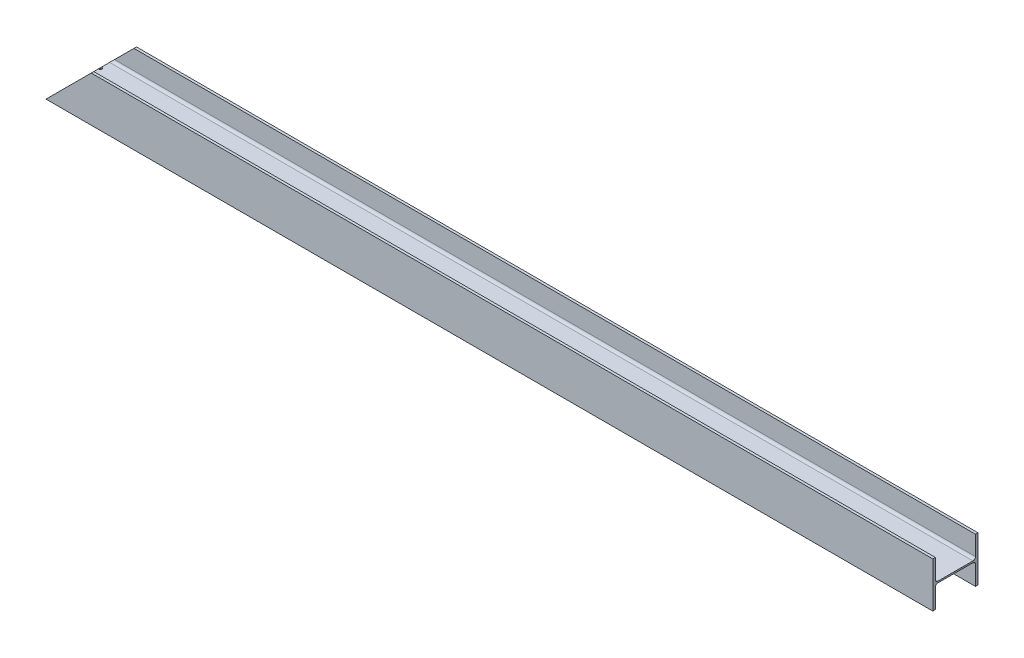
ISO-10303-21;
HEADER;
FILE_DESCRIPTION(('STEP AP214'),'2;1');
FILE_NAME('part.step','',(''),(''),'','','');
FILE_SCHEMA(('AUTOMOTIVE_DESIGN { 1 0 10303 214 1 1 1 1 }'));
ENDSEC;
DATA;
#1=APPLICATION_CONTEXT('core data for automotive mechanical design processes');
#2=APPLICATION_PROTOCOL_DEFINITION('international standard','automotive_design',2000,#1);
#3=PRODUCT_CONTEXT('',#1,'mechanical');
#4=PRODUCT('Part','Part','',(#3));
#5=PRODUCT_RELATED_PRODUCT_CATEGORY('part','',(#4));
#6=PRODUCT_DEFINITION_FORMATION('','',#4);
#7=PRODUCT_DEFINITION_CONTEXT('part definition',#1,'design');
#8=PRODUCT_DEFINITION('design','',#6,#7);
#9=PRODUCT_DEFINITION_SHAPE('','',#8);
#10=(LENGTH_UNIT() NAMED_UNIT(*) SI_UNIT(.MILLI.,.METRE.));
#11=(NAMED_UNIT(*) PLANE_ANGLE_UNIT() SI_UNIT($,.RADIAN.));
#12=(NAMED_UNIT(*) SI_UNIT($,.STERADIAN.) SOLID_ANGLE_UNIT());
#13=UNCERTAINTY_MEASURE_WITH_UNIT(LENGTH_MEASURE(1.E-05),#10,'distance_accuracy_value','');
#14=(GEOMETRIC_REPRESENTATION_CONTEXT(3) GLOBAL_UNCERTAINTY_ASSIGNED_CONTEXT((#13)) GLOBAL_UNIT_ASSIGNED_CONTEXT((#10,
#11,#12)) REPRESENTATION_CONTEXT('',''));
#15=CARTESIAN_POINT('',(0.,0.,0.));
#16=DIRECTION('',(0.,0.,1.));
#17=DIRECTION('',(1.,0.,0.));
#18=AXIS2_PLACEMENT_3D('',#15,#16,#17);
#19=CARTESIAN_POINT('',(-5000.,-127.,127.));
#20=DIRECTION('',(0.,-1.,0.));
#21=DIRECTION('',(0.,0.,-1.));
#22=AXIS2_PLACEMENT_3D('',#19,#20,#21);
#23=PLANE('',#22);
#24=DIRECTION('',(0.,0.,-1.));
#25=VECTOR('',#24,1.);
#26=CARTESIAN_POINT('',(-9.99999999999979,-127.,127.));
#27=LINE('',#26,#25);
#28=CARTESIAN_POINT('',(-9.99999999999979,-127.,127.));
#29=VERTEX_POINT('',#28);
#30=CARTESIAN_POINT('',(-9.99999999999979,-127.,112.8));
#31=VERTEX_POINT('',#30);
#32=EDGE_CURVE('E101',#29,#31,#27,.T.);
#33=ORIENTED_EDGE('',*,*,#32,.F.);
#34=DIRECTION('',(1.,0.,0.));
#35=VECTOR('',#34,1.);
#36=CARTESIAN_POINT('',(-5000.,-127.,127.));
#37=LINE('',#36,#35);
#38=CARTESIAN_POINT('',(-4990.,-126.999999999997,127.));
#39=VERTEX_POINT('',#38);
#40=EDGE_CURVE('E95',#39,#29,#37,.T.);
#41=ORIENTED_EDGE('',*,*,#40,.F.);
#42=DIRECTION('',(0.,0.,1.));
#43=VECTOR('',#42,1.);
#44=CARTESIAN_POINT('',(-4990.,-126.999999999998,-126.999999999996));
#45=LINE('',#44,#43);
#46=CARTESIAN_POINT('',(-4990.,-126.999999999997,112.8));
#47=VERTEX_POINT('',#46);
#48=EDGE_CURVE('E282',#47,#39,#45,.T.);
#49=ORIENTED_EDGE('',*,*,#48,.F.);
#50=DIRECTION('',(1.,0.,0.));
#51=VECTOR('',#50,1.);
#52=CARTESIAN_POINT('',(-5000.,-127.,112.8));
#53=LINE('',#52,#51);
#54=EDGE_CURVE('E284',#47,#31,#53,.T.);
#55=ORIENTED_EDGE('',*,*,#54,.T.);
#56=EDGE_LOOP('',(#33,#41,#49,#55));
#57=FACE_BOUND('',#56,.T.);
#58=ADVANCED_FACE('F88',(#57),#23,.T.);
#59=CARTESIAN_POINT('',(-5000.,-127.,127.));
#60=DIRECTION('',(0.,0.,-1.));
#61=DIRECTION('',(0.,1.,0.));
#62=AXIS2_PLACEMENT_3D('',#59,#60,#61);
#63=PLANE('',#62);
#64=DIRECTION('',(1.,0.,0.));
#65=VECTOR('',#64,1.);
#66=CARTESIAN_POINT('',(-5000.,127.,127.));
#67=LINE('',#66,#65);
#68=CARTESIAN_POINT('',(-4736.,127.000000000003,127.));
#69=VERTEX_POINT('',#68);
#70=CARTESIAN_POINT('',(-9.99999999999979,127.,127.));
#71=VERTEX_POINT('',#70);
#72=EDGE_CURVE('E271',#69,#71,#67,.T.);
#73=ORIENTED_EDGE('',*,*,#72,.F.);
#74=DIRECTION('',(0.707106781186547,0.707106781186548,0.));
#75=VECTOR('',#74,1.);
#76=CARTESIAN_POINT('',(-4990.,-126.999999999997,127.));
#77=LINE('',#76,#75);
#78=EDGE_CURVE('E246',#39,#69,#77,.T.);
#79=ORIENTED_EDGE('',*,*,#78,.F.);
#80=ORIENTED_EDGE('',*,*,#40,.T.);
#81=DIRECTION('',(0.,1.,0.));
#82=VECTOR('',#81,1.);
#83=CARTESIAN_POINT('',(-9.99999999999979,-127.,127.));
#84=LINE('',#83,#82);
#85=EDGE_CURVE('E279',#29,#71,#84,.T.);
#86=ORIENTED_EDGE('',*,*,#85,.T.);
#87=EDGE_LOOP('',(#73,#79,#80,#86));
#88=FACE_BOUND('',#87,.T.);
#89=ADVANCED_FACE('F278',(#88),#63,.F.);
#90=CARTESIAN_POINT('',(-5000.,127.,127.));
#91=DIRECTION('',(0.,-1.,0.));
#92=DIRECTION('',(0.,0.,-1.));
#93=AXIS2_PLACEMENT_3D('',#90,#91,#92);
#94=PLANE('',#93);
#95=DIRECTION('',(1.,0.,0.));
#96=VECTOR('',#95,1.);
#97=CARTESIAN_POINT('',(-5000.,127.000000000001,112.8));
#98=LINE('',#97,#96);
#99=CARTESIAN_POINT('',(-4736.,127.000000000003,112.8));
#100=VERTEX_POINT('',#99);
#101=CARTESIAN_POINT('',(-9.99999999999979,127.000000000001,112.8));
#102=VERTEX_POINT('',#101);
#103=EDGE_CURVE('E269',#100,#102,#98,.T.);
#104=ORIENTED_EDGE('',*,*,#103,.F.);
#105=DIRECTION('',(0.,0.,1.));
#106=VECTOR('',#105,1.);
#107=CARTESIAN_POINT('',(-4736.,127.000000000003,-127.));
#108=LINE('',#107,#106);
#109=EDGE_CURVE('E233',#100,#69,#108,.T.);
#110=ORIENTED_EDGE('',*,*,#109,.T.);
#111=ORIENTED_EDGE('',*,*,#72,.T.);
#112=DIRECTION('',(0.,0.,-1.));
#113=VECTOR('',#112,1.);
#114=CARTESIAN_POINT('',(-9.99999999999979,127.,127.));
#115=LINE('',#114,#113);
#116=EDGE_CURVE('E288',#71,#102,#115,.T.);
#117=ORIENTED_EDGE('',*,*,#116,.T.);
#118=EDGE_LOOP('',(#104,#110,#111,#117));
#119=FACE_BOUND('',#118,.T.);
#120=ADVANCED_FACE('F363',(#119),#94,.F.);
#121=CARTESIAN_POINT('',(-5000.,127.000000000001,112.8));
#122=DIRECTION('',(0.,0.,1.));
#123=DIRECTION('',(0.,-1.,0.));
#124=AXIS2_PLACEMENT_3D('',#121,#122,#123);
#125=PLANE('',#124);
#126=DIRECTION('',(1.,0.,0.));
#127=VECTOR('',#126,1.);
#128=CARTESIAN_POINT('',(-5000.,18.3000000000004,112.8));
#129=LINE('',#128,#127);
#130=CARTESIAN_POINT('',(-4844.7,18.3000000000004,112.8));
#131=VERTEX_POINT('',#130);
#132=CARTESIAN_POINT('',(-9.99999999999979,18.3000000000003,112.8));
#133=VERTEX_POINT('',#132);
#134=EDGE_CURVE('E267',#131,#133,#129,.T.);
#135=ORIENTED_EDGE('',*,*,#134,.F.);
#136=DIRECTION('',(0.707106781186547,0.707106781186548,0.));
#137=VECTOR('',#136,1.);
#138=CARTESIAN_POINT('',(-4868.,-4.99999999999787,112.8));
#139=LINE('',#138,#137);
#140=EDGE_CURVE('E373',#131,#100,#139,.T.);
#141=ORIENTED_EDGE('',*,*,#140,.T.);
#142=ORIENTED_EDGE('',*,*,#103,.T.);
#143=DIRECTION('',(0.,-1.,0.));
#144=VECTOR('',#143,1.);
#145=CARTESIAN_POINT('',(-9.99999999999979,127.000000000001,112.8));
#146=LINE('',#145,#144);
#147=EDGE_CURVE('E357',#102,#133,#146,.T.);
#148=ORIENTED_EDGE('',*,*,#147,.T.);
#149=EDGE_LOOP('',(#135,#141,#142,#148));
#150=FACE_BOUND('',#149,.T.);
#151=ADVANCED_FACE('F371',(#150),#125,.F.);
#152=CARTESIAN_POINT('',(-5000.,18.3000000000003,98.8));
#153=DIRECTION('',(1.,0.,0.));
#154=DIRECTION('',(0.,0.,-1.));
#155=AXIS2_PLACEMENT_3D('',#152,#153,#154);
#156=CYLINDRICAL_SURFACE('',#155,14.);
#157=DIRECTION('',(1.,0.,0.));
#158=VECTOR('',#157,1.);
#159=CARTESIAN_POINT('',(-5000.,4.30000000000035,98.8));
#160=LINE('',#159,#158);
#161=CARTESIAN_POINT('',(-4858.7,4.30000000000035,98.8));
#162=VERTEX_POINT('',#161);
#163=CARTESIAN_POINT('',(-9.99999999999979,4.30000000000035,98.8));
#164=VERTEX_POINT('',#163);
#165=EDGE_CURVE('E265',#162,#164,#160,.T.);
#166=ORIENTED_EDGE('',*,*,#165,.F.);
#167=CARTESIAN_POINT('',(-4844.7,18.3000000000003,98.8));
#168=DIRECTION('',(0.707106781186548,-0.707106781186547,0.));
#169=DIRECTION('',(0.707106781186547,0.707106781186548,0.));
#170=AXIS2_PLACEMENT_3D('',#167,#168,#169);
#171=ELLIPSE('',#170,19.7989898732233,14.);
#172=EDGE_CURVE('E376',#162,#131,#171,.F.);
#173=ORIENTED_EDGE('',*,*,#172,.T.);
#174=ORIENTED_EDGE('',*,*,#134,.T.);
#175=CARTESIAN_POINT('',(-9.99999999999979,18.3000000000003,98.8));
#176=DIRECTION('',(-1.,0.,0.));
#177=DIRECTION('',(0.,0.,1.));
#178=AXIS2_PLACEMENT_3D('',#175,#176,#177);
#179=CIRCLE('',#178,14.);
#180=EDGE_CURVE('E354',#133,#164,#179,.F.);
#181=ORIENTED_EDGE('',*,*,#180,.T.);
#182=EDGE_LOOP('',(#166,#173,#174,#181));
#183=FACE_BOUND('',#182,.T.);
#184=ADVANCED_FACE('F451',(#183),#156,.F.);
#185=CARTESIAN_POINT('',(-5000.,4.30000000000035,98.8));
#186=DIRECTION('',(0.,-1.,0.));
#187=DIRECTION('',(0.,0.,-1.));
#188=AXIS2_PLACEMENT_3D('',#185,#186,#187);
#189=PLANE('',#188);
#190=DIRECTION('',(1.,0.,0.));
#191=VECTOR('',#190,1.);
#192=CARTESIAN_POINT('',(-5000.,4.29999999999966,-98.8));
#193=LINE('',#192,#191);
#194=CARTESIAN_POINT('',(-4858.7,4.29999999999966,-98.8));
#195=VERTEX_POINT('',#194);
#196=CARTESIAN_POINT('',(-9.99999999999979,4.29999999999966,-98.8));
#197=VERTEX_POINT('',#196);
#198=EDGE_CURVE('E263',#195,#197,#193,.T.);
#199=ORIENTED_EDGE('',*,*,#198,.F.);
#200=DIRECTION('',(0.,0.,1.));
#201=VECTOR('',#200,1.);
#202=CARTESIAN_POINT('',(-4858.7,4.30000000000035,98.7999999999995));
#203=LINE('',#202,#201);
#204=CARTESIAN_POINT('',(-4858.70000000007,4.29999999993608,-53.8379861959636));
#205=VERTEX_POINT('',#204);
#206=EDGE_CURVE('E379',#195,#205,#203,.T.);
#207=ORIENTED_EDGE('',*,*,#206,.T.);
#208=CARTESIAN_POINT('',(-4857.,4.29999999993608,-45.0000000000148));
#209=DIRECTION('',(0.,1.,0.));
#210=DIRECTION('',(-1.,0.,0.));
#211=AXIS2_PLACEMENT_3D('',#208,#209,#210);
#212=CIRCLE('',#211,9.00000000000008);
#213=CARTESIAN_POINT('',(-4858.7,4.29999999993611,-36.1620138040537));
#214=VERTEX_POINT('',#213);
#215=EDGE_CURVE('E296',#214,#205,#212,.T.);
#216=ORIENTED_EDGE('',*,*,#215,.F.);
#217=CARTESIAN_POINT('',(-4858.70000000007,4.29999999993607,36.1620138040365));
#218=VERTEX_POINT('',#217);
#219=EDGE_CURVE('E381',#214,#218,#203,.T.);
#220=ORIENTED_EDGE('',*,*,#219,.T.);
#221=CARTESIAN_POINT('',(-4857.,4.29999999993607,44.9999999999852));
#222=DIRECTION('',(0.,1.,0.));
#223=DIRECTION('',(-1.,0.,0.));
#224=AXIS2_PLACEMENT_3D('',#221,#222,#223);
#225=CIRCLE('',#224,9.00000000000007);
#226=CARTESIAN_POINT('',(-4858.70000000007,4.29999999993607,53.837986195934));
#227=VERTEX_POINT('',#226);
#228=EDGE_CURVE('E292',#227,#218,#225,.T.);
#229=ORIENTED_EDGE('',*,*,#228,.F.);
#230=EDGE_CURVE('E661',#227,#162,#203,.T.);
#231=ORIENTED_EDGE('',*,*,#230,.T.);
#232=ORIENTED_EDGE('',*,*,#165,.T.);
#233=DIRECTION('',(0.,0.,-1.));
#234=VECTOR('',#233,1.);
#235=CARTESIAN_POINT('',(-9.99999999999979,4.30000000000035,98.8));
#236=LINE('',#235,#234);
#237=EDGE_CURVE('E351',#164,#197,#236,.T.);
#238=ORIENTED_EDGE('',*,*,#237,.T.);
#239=EDGE_LOOP('',(#199,#207,#216,#220,#229,#231,#232,#238));
#240=FACE_BOUND('',#239,.T.);
#241=ADVANCED_FACE('F454',(#240),#189,.F.);
#242=CARTESIAN_POINT('',(-5000.,18.2999999999997,-98.8000000000001));
#243=DIRECTION('',(1.,0.,0.));
#244=DIRECTION('',(0.,0.,-1.));
#245=AXIS2_PLACEMENT_3D('',#242,#243,#244);
#246=CYLINDRICAL_SURFACE('',#245,14.);
#247=CARTESIAN_POINT('',(-4844.7,18.2999999999997,-98.8000000000001));
#248=DIRECTION('',(0.707106781186548,-0.707106781186547,0.));
#249=DIRECTION('',(0.707106781186547,0.707106781186548,0.));
#250=AXIS2_PLACEMENT_3D('',#247,#248,#249);
#251=ELLIPSE('',#250,19.7989898732233,14.);
#252=CARTESIAN_POINT('',(-4844.7,18.2999999999996,-112.8));
#253=VERTEX_POINT('',#252);
#254=EDGE_CURVE('E385',#195,#253,#251,.T.);
#255=ORIENTED_EDGE('',*,*,#254,.F.);
#256=ORIENTED_EDGE('',*,*,#198,.T.);
#257=CARTESIAN_POINT('',(-9.99999999999979,18.2999999999997,-98.8000000000001));
#258=DIRECTION('',(-1.,0.,0.));
#259=DIRECTION('',(0.,0.,1.));
#260=AXIS2_PLACEMENT_3D('',#257,#258,#259);
#261=CIRCLE('',#260,14.);
#262=CARTESIAN_POINT('',(-9.99999999999979,18.2999999999996,-112.8));
#263=VERTEX_POINT('',#262);
#264=EDGE_CURVE('E348',#263,#197,#261,.T.);
#265=ORIENTED_EDGE('',*,*,#264,.F.);
#266=DIRECTION('',(1.,0.,0.));
#267=VECTOR('',#266,1.);
#268=CARTESIAN_POINT('',(-5000.,18.2999999999996,-112.8));
#269=LINE('',#268,#267);
#270=EDGE_CURVE('E255',#253,#263,#269,.T.);
#271=ORIENTED_EDGE('',*,*,#270,.F.);
#272=EDGE_LOOP('',(#255,#256,#265,#271));
#273=FACE_BOUND('',#272,.T.);
#274=ADVANCED_FACE('F458',(#273),#246,.F.);
#275=CARTESIAN_POINT('',(-5000.,127.,-112.8));
#276=DIRECTION('',(0.,0.,1.));
#277=DIRECTION('',(0.,-1.,0.));
#278=AXIS2_PLACEMENT_3D('',#275,#276,#277);
#279=PLANE('',#278);
#280=DIRECTION('',(0.707106781186547,0.707106781186548,0.));
#281=VECTOR('',#280,1.);
#282=CARTESIAN_POINT('',(-4868.,-4.99999999999828,-112.8));
#283=LINE('',#282,#281);
#284=CARTESIAN_POINT('',(-4736.,127.000000000003,-112.8));
#285=VERTEX_POINT('',#284);
#286=EDGE_CURVE('E228',#253,#285,#283,.T.);
#287=ORIENTED_EDGE('',*,*,#286,.F.);
#288=ORIENTED_EDGE('',*,*,#270,.T.);
#289=DIRECTION('',(0.,-1.,0.));
#290=VECTOR('',#289,1.);
#291=CARTESIAN_POINT('',(-9.99999999999979,127.,-112.8));
#292=LINE('',#291,#290);
#293=CARTESIAN_POINT('',(-9.99999999999979,127.,-112.8));
#294=VERTEX_POINT('',#293);
#295=EDGE_CURVE('E345',#294,#263,#292,.T.);
#296=ORIENTED_EDGE('',*,*,#295,.F.);
#297=DIRECTION('',(1.,0.,0.));
#298=VECTOR('',#297,1.);
#299=CARTESIAN_POINT('',(-5000.,127.,-112.8));
#300=LINE('',#299,#298);
#301=EDGE_CURVE('E252',#285,#294,#300,.T.);
#302=ORIENTED_EDGE('',*,*,#301,.F.);
#303=EDGE_LOOP('',(#287,#288,#296,#302));
#304=FACE_BOUND('',#303,.T.);
#305=ADVANCED_FACE('F462',(#304),#279,.T.);
#306=CARTESIAN_POINT('',(-5000.,127.,-127.));
#307=DIRECTION('',(0.,1.,0.));
#308=DIRECTION('',(0.,0.,1.));
#309=AXIS2_PLACEMENT_3D('',#306,#307,#308);
#310=PLANE('',#309);
#311=CARTESIAN_POINT('',(-4736.,127.000000000003,-127.));
#312=VERTEX_POINT('',#311);
#313=EDGE_CURVE('E222',#312,#285,#108,.T.);
#314=ORIENTED_EDGE('',*,*,#313,.T.);
#315=ORIENTED_EDGE('',*,*,#301,.T.);
#316=DIRECTION('',(0.,0.,1.));
#317=VECTOR('',#316,1.);
#318=CARTESIAN_POINT('',(-9.99999999999979,127.,-127.));
#319=LINE('',#318,#317);
#320=CARTESIAN_POINT('',(-9.99999999999979,127.,-127.));
#321=VERTEX_POINT('',#320);
#322=EDGE_CURVE('E251',#321,#294,#319,.T.);
#323=ORIENTED_EDGE('',*,*,#322,.F.);
#324=DIRECTION('',(1.,0.,0.));
#325=VECTOR('',#324,1.);
#326=CARTESIAN_POINT('',(-5000.,127.,-127.));
#327=LINE('',#326,#325);
#328=EDGE_CURVE('E240',#312,#321,#327,.T.);
#329=ORIENTED_EDGE('',*,*,#328,.F.);
#330=EDGE_LOOP('',(#314,#315,#323,#329));
#331=FACE_BOUND('',#330,.T.);
#332=ADVANCED_FACE('F249',(#331),#310,.T.);
#333=CARTESIAN_POINT('',(-5000.,-127.,-127.));
#334=DIRECTION('',(0.,0.,-1.));
#335=DIRECTION('',(0.,1.,0.));
#336=AXIS2_PLACEMENT_3D('',#333,#334,#335);
#337=PLANE('',#336);
#338=DIRECTION('',(0.707106781186547,0.707106781186548,0.));
#339=VECTOR('',#338,1.);
#340=CARTESIAN_POINT('',(-4990.,-126.999999999997,-127.));
#341=LINE('',#340,#339);
#342=CARTESIAN_POINT('',(-4902.38751391979,-39.3875139197906,-127.));
#343=VERTEX_POINT('',#342);
#344=EDGE_CURVE('E225',#343,#312,#341,.T.);
#345=ORIENTED_EDGE('',*,*,#344,.T.);
#346=ORIENTED_EDGE('',*,*,#328,.T.);
#347=DIRECTION('',(0.,1.,0.));
#348=VECTOR('',#347,1.);
#349=CARTESIAN_POINT('',(-9.99999999999979,-127.,-127.));
#350=LINE('',#349,#348);
#351=CARTESIAN_POINT('',(-9.99999999999979,-127.,-127.));
#352=VERTEX_POINT('',#351);
#353=EDGE_CURVE('E337',#352,#321,#350,.T.);
#354=ORIENTED_EDGE('',*,*,#353,.F.);
#355=DIRECTION('',(1.,0.,0.));
#356=VECTOR('',#355,1.);
#357=CARTESIAN_POINT('',(-5000.,-127.,-127.));
#358=LINE('',#357,#356);
#359=CARTESIAN_POINT('',(-4990.,-126.999999999998,-126.999999999996));
#360=VERTEX_POINT('',#359);
#361=EDGE_CURVE('E253',#360,#352,#358,.T.);
#362=ORIENTED_EDGE('',*,*,#361,.F.);
#363=CARTESIAN_POINT('',(-4913.61248608015,-50.6124860801441,-127.));
#364=VERTEX_POINT('',#363);
#365=EDGE_CURVE('E245',#360,#364,#341,.T.);
#366=ORIENTED_EDGE('',*,*,#365,.T.);
#367=CARTESIAN_POINT('',(-4905.,-47.9999999999378,-126.999999999985));
#368=DIRECTION('',(0.,0.,-1.));
#369=DIRECTION('',(0.,1.,0.));
#370=AXIS2_PLACEMENT_3D('',#367,#368,#369);
#371=CIRCLE('',#370,9.00000000000007);
#372=EDGE_CURVE('E244',#343,#364,#371,.T.);
#373=ORIENTED_EDGE('',*,*,#372,.F.);
#374=EDGE_LOOP('',(#345,#346,#354,#362,#366,#373));
#375=FACE_BOUND('',#374,.T.);
#376=CARTESIAN_POINT('',(-4857.,-47.9999999999378,-126.999999999985));
#377=DIRECTION('',(0.,0.,-1.));
#378=DIRECTION('',(0.,1.,0.));
#379=AXIS2_PLACEMENT_3D('',#376,#377,#378);
#380=CIRCLE('',#379,9.00000000000007);
#381=CARTESIAN_POINT('',(-4857.,-38.9999999999378,-126.999999999985));
#382=VERTEX_POINT('',#381);
#383=EDGE_CURVE('E307',#382,#382,#380,.T.);
#384=ORIENTED_EDGE('',*,*,#383,.F.);
#385=EDGE_LOOP('',(#384));
#386=FACE_BOUND('',#385,.T.);
#387=ADVANCED_FACE('F237',(#375,#386),#337,.T.);
#388=CARTESIAN_POINT('',(-5000.,-127.,-127.));
#389=DIRECTION('',(0.,1.,0.));
#390=DIRECTION('',(0.,0.,1.));
#391=AXIS2_PLACEMENT_3D('',#388,#389,#390);
#392=PLANE('',#391);
#393=ORIENTED_EDGE('',*,*,#361,.T.);
#394=DIRECTION('',(0.,0.,1.));
#395=VECTOR('',#394,1.);
#396=CARTESIAN_POINT('',(-9.99999999999979,-127.,-127.));
#397=LINE('',#396,#395);
#398=CARTESIAN_POINT('',(-9.99999999999979,-127.000000000001,-112.8));
#399=VERTEX_POINT('',#398);
#400=EDGE_CURVE('E336',#352,#399,#397,.T.);
#401=ORIENTED_EDGE('',*,*,#400,.T.);
#402=DIRECTION('',(1.,0.,0.));
#403=VECTOR('',#402,1.);
#404=CARTESIAN_POINT('',(-5000.,-127.000000000001,-112.8));
#405=LINE('',#404,#403);
#406=CARTESIAN_POINT('',(-4990.,-126.999999999997,-112.8));
#407=VERTEX_POINT('',#406);
#408=EDGE_CURVE('E258',#407,#399,#405,.T.);
#409=ORIENTED_EDGE('',*,*,#408,.F.);
#410=EDGE_CURVE('E286',#360,#407,#45,.T.);
#411=ORIENTED_EDGE('',*,*,#410,.F.);
#412=EDGE_LOOP('',(#393,#401,#409,#411));
#413=FACE_BOUND('',#412,.T.);
#414=ADVANCED_FACE('F334',(#413),#392,.F.);
#415=CARTESIAN_POINT('',(-5000.,-127.000000000001,-112.8));
#416=DIRECTION('',(0.,0.,-1.));
#417=DIRECTION('',(0.,1.,0.));
#418=AXIS2_PLACEMENT_3D('',#415,#416,#417);
#419=PLANE('',#418);
#420=CARTESIAN_POINT('',(-4857.,-47.9999999999378,-112.799999999985));
#421=DIRECTION('',(0.,0.,-1.));
#422=DIRECTION('',(0.,1.,0.));
#423=AXIS2_PLACEMENT_3D('',#420,#421,#422);
#424=CIRCLE('',#423,9.00000000000007);
#425=CARTESIAN_POINT('',(-4857.,-38.9999999999377,-112.799999999985));
#426=VERTEX_POINT('',#425);
#427=EDGE_CURVE('E309',#426,#426,#424,.T.);
#428=ORIENTED_EDGE('',*,*,#427,.T.);
#429=EDGE_LOOP('',(#428));
#430=FACE_BOUND('',#429,.T.);
#431=DIRECTION('',(1.,0.,0.));
#432=VECTOR('',#431,1.);
#433=CARTESIAN_POINT('',(-5000.,-18.3000000000004,-112.8));
#434=LINE('',#433,#432);
#435=CARTESIAN_POINT('',(-4881.3,-18.3000000000004,-112.8));
#436=VERTEX_POINT('',#435);
#437=CARTESIAN_POINT('',(-9.99999999999979,-18.3000000000004,-112.8));
#438=VERTEX_POINT('',#437);
#439=EDGE_CURVE('E321',#436,#438,#434,.T.);
#440=ORIENTED_EDGE('',*,*,#439,.F.);
#441=DIRECTION('',(-0.707106781186547,-0.707106781186548,0.));
#442=VECTOR('',#441,1.);
#443=CARTESIAN_POINT('',(-4995.,-131.999999999999,-112.8));
#444=LINE('',#443,#442);
#445=CARTESIAN_POINT('',(-4902.38751391979,-39.3875139197906,-112.799999999985));
#446=VERTEX_POINT('',#445);
#447=EDGE_CURVE('E390',#436,#446,#444,.T.);
#448=ORIENTED_EDGE('',*,*,#447,.T.);
#449=CARTESIAN_POINT('',(-4905.,-47.9999999999378,-112.799999999985));
#450=DIRECTION('',(0.,0.,-1.));
#451=DIRECTION('',(0.,1.,0.));
#452=AXIS2_PLACEMENT_3D('',#449,#450,#451);
#453=CIRCLE('',#452,9.00000000000007);
#454=CARTESIAN_POINT('',(-4913.61248608015,-50.612486080144,-112.799999999985));
#455=VERTEX_POINT('',#454);
#456=EDGE_CURVE('E304',#446,#455,#453,.T.);
#457=ORIENTED_EDGE('',*,*,#456,.T.);
#458=EDGE_CURVE('E330',#455,#407,#444,.T.);
#459=ORIENTED_EDGE('',*,*,#458,.T.);
#460=ORIENTED_EDGE('',*,*,#408,.T.);
#461=DIRECTION('',(0.,1.,0.));
#462=VECTOR('',#461,1.);
#463=CARTESIAN_POINT('',(-9.99999999999979,-127.000000000001,-112.8));
#464=LINE('',#463,#462);
#465=EDGE_CURVE('E329',#399,#438,#464,.T.);
#466=ORIENTED_EDGE('',*,*,#465,.T.);
#467=EDGE_LOOP('',(#440,#448,#457,#459,#460,#466));
#468=FACE_BOUND('',#467,.T.);
#469=ADVANCED_FACE('F328',(#430,#468),#419,.F.);
#470=CARTESIAN_POINT('',(-5000.,-18.3000000000003,-98.8));
#471=DIRECTION('',(1.,0.,0.));
#472=DIRECTION('',(0.,0.,-1.));
#473=AXIS2_PLACEMENT_3D('',#470,#471,#472);
#474=CYLINDRICAL_SURFACE('',#473,14.);
#475=DIRECTION('',(1.,0.,0.));
#476=VECTOR('',#475,1.);
#477=CARTESIAN_POINT('',(-5000.,-4.30000000000035,-98.8));
#478=LINE('',#477,#476);
#479=CARTESIAN_POINT('',(-4867.3,-4.30000000000035,-98.8));
#480=VERTEX_POINT('',#479);
#481=CARTESIAN_POINT('',(-9.99999999999979,-4.30000000000035,-98.8));
#482=VERTEX_POINT('',#481);
#483=EDGE_CURVE('E319',#480,#482,#478,.T.);
#484=ORIENTED_EDGE('',*,*,#483,.F.);
#485=CARTESIAN_POINT('',(-4881.3,-18.3000000000003,-98.8));
#486=DIRECTION('',(0.707106781186548,-0.707106781186547,0.));
#487=DIRECTION('',(0.707106781186547,0.707106781186548,0.));
#488=AXIS2_PLACEMENT_3D('',#485,#486,#487);
#489=ELLIPSE('',#488,19.7989898732233,14.);
#490=EDGE_CURVE('E393',#480,#436,#489,.F.);
#491=ORIENTED_EDGE('',*,*,#490,.T.);
#492=ORIENTED_EDGE('',*,*,#439,.T.);
#493=CARTESIAN_POINT('',(-9.99999999999979,-18.3000000000003,-98.8));
#494=DIRECTION('',(-1.,0.,0.));
#495=DIRECTION('',(0.,0.,1.));
#496=AXIS2_PLACEMENT_3D('',#493,#494,#495);
#497=CIRCLE('',#496,14.);
#498=EDGE_CURVE('E340',#438,#482,#497,.F.);
#499=ORIENTED_EDGE('',*,*,#498,.T.);
#500=EDGE_LOOP('',(#484,#491,#492,#499));
#501=FACE_BOUND('',#500,.T.);
#502=ADVANCED_FACE('F413',(#501),#474,.F.);
#503=CARTESIAN_POINT('',(-5000.,-4.29999999999966,98.8));
#504=DIRECTION('',(0.,-1.,0.));
#505=DIRECTION('',(0.,0.,-1.));
#506=AXIS2_PLACEMENT_3D('',#503,#504,#505);
#507=PLANE('',#506);
#508=DIRECTION('',(0.,0.,1.));
#509=VECTOR('',#508,1.);
#510=CARTESIAN_POINT('',(-4867.3,-4.29999999999966,98.7999999999996));
#511=LINE('',#510,#509);
#512=CARTESIAN_POINT('',(-4867.3,-4.29999999999966,98.8));
#513=VERTEX_POINT('',#512);
#514=EDGE_CURVE('E396',#480,#513,#511,.T.);
#515=ORIENTED_EDGE('',*,*,#514,.F.);
#516=ORIENTED_EDGE('',*,*,#483,.T.);
#517=DIRECTION('',(0.,0.,-1.));
#518=VECTOR('',#517,1.);
#519=CARTESIAN_POINT('',(-9.99999999999979,-4.29999999999966,98.8));
#520=LINE('',#519,#518);
#521=CARTESIAN_POINT('',(-9.99999999999979,-4.29999999999966,98.8));
#522=VERTEX_POINT('',#521);
#523=EDGE_CURVE('E407',#522,#482,#520,.T.);
#524=ORIENTED_EDGE('',*,*,#523,.F.);
#525=DIRECTION('',(1.,0.,0.));
#526=VECTOR('',#525,1.);
#527=CARTESIAN_POINT('',(-5000.,-4.29999999999966,98.8));
#528=LINE('',#527,#526);
#529=EDGE_CURVE('E317',#513,#522,#528,.T.);
#530=ORIENTED_EDGE('',*,*,#529,.F.);
#531=EDGE_LOOP('',(#515,#516,#524,#530));
#532=FACE_BOUND('',#531,.T.);
#533=CARTESIAN_POINT('',(-4857.,-4.30000000006393,44.9999999999852));
#534=DIRECTION('',(0.,1.,0.));
#535=DIRECTION('',(-1.,0.,0.));
#536=AXIS2_PLACEMENT_3D('',#533,#534,#535);
#537=CIRCLE('',#536,9.00000000000007);
#538=CARTESIAN_POINT('',(-4866.,-4.30000000006393,44.9999999999852));
#539=VERTEX_POINT('',#538);
#540=EDGE_CURVE('E293',#539,#539,#537,.T.);
#541=ORIENTED_EDGE('',*,*,#540,.T.);
#542=EDGE_LOOP('',(#541));
#543=FACE_BOUND('',#542,.T.);
#544=CARTESIAN_POINT('',(-4857.,-4.30000000006392,-45.0000000000148));
#545=DIRECTION('',(0.,1.,0.));
#546=DIRECTION('',(-1.,0.,0.));
#547=AXIS2_PLACEMENT_3D('',#544,#545,#546);
#548=CIRCLE('',#547,9.00000000000008);
#549=CARTESIAN_POINT('',(-4866.,-4.30000000006393,-45.0000000000148));
#550=VERTEX_POINT('',#549);
#551=EDGE_CURVE('E299',#550,#550,#548,.T.);
#552=ORIENTED_EDGE('',*,*,#551,.T.);
#553=EDGE_LOOP('',(#552));
#554=FACE_BOUND('',#553,.T.);
#555=ADVANCED_FACE('F419',(#532,#543,#554),#507,.T.);
#556=CARTESIAN_POINT('',(-5000.,-18.2999999999997,98.8000000000001));
#557=DIRECTION('',(1.,0.,0.));
#558=DIRECTION('',(0.,0.,-1.));
#559=AXIS2_PLACEMENT_3D('',#556,#557,#558);
#560=CYLINDRICAL_SURFACE('',#559,14.);
#561=CARTESIAN_POINT('',(-4881.3,-18.2999999999997,98.8000000000001));
#562=DIRECTION('',(0.707106781186548,-0.707106781186547,0.));
#563=DIRECTION('',(0.707106781186547,0.707106781186548,0.));
#564=AXIS2_PLACEMENT_3D('',#561,#562,#563);
#565=ELLIPSE('',#564,19.7989898732233,14.);
#566=CARTESIAN_POINT('',(-4881.3,-18.2999999999996,112.8));
#567=VERTEX_POINT('',#566);
#568=EDGE_CURVE('E398',#513,#567,#565,.T.);
#569=ORIENTED_EDGE('',*,*,#568,.F.);
#570=ORIENTED_EDGE('',*,*,#529,.T.);
#571=CARTESIAN_POINT('',(-9.99999999999979,-18.2999999999997,98.8000000000001));
#572=DIRECTION('',(-1.,0.,0.));
#573=DIRECTION('',(0.,0.,1.));
#574=AXIS2_PLACEMENT_3D('',#571,#572,#573);
#575=CIRCLE('',#574,14.);
#576=CARTESIAN_POINT('',(-9.99999999999979,-18.2999999999996,112.8));
#577=VERTEX_POINT('',#576);
#578=EDGE_CURVE('E404',#577,#522,#575,.T.);
#579=ORIENTED_EDGE('',*,*,#578,.F.);
#580=DIRECTION('',(1.,0.,0.));
#581=VECTOR('',#580,1.);
#582=CARTESIAN_POINT('',(-5000.,-18.2999999999996,112.8));
#583=LINE('',#582,#581);
#584=EDGE_CURVE('E315',#567,#577,#583,.T.);
#585=ORIENTED_EDGE('',*,*,#584,.F.);
#586=EDGE_LOOP('',(#569,#570,#579,#585));
#587=FACE_BOUND('',#586,.T.);
#588=ADVANCED_FACE('F424',(#587),#560,.F.);
#589=CARTESIAN_POINT('',(-5000.,-127.,112.8));
#590=DIRECTION('',(0.,0.,-1.));
#591=DIRECTION('',(0.,1.,0.));
#592=AXIS2_PLACEMENT_3D('',#589,#590,#591);
#593=PLANE('',#592);
#594=DIRECTION('',(-0.707106781186547,-0.707106781186548,0.));
#595=VECTOR('',#594,1.);
#596=CARTESIAN_POINT('',(-4995.,-131.999999999998,112.8));
#597=LINE('',#596,#595);
#598=EDGE_CURVE('E109',#567,#47,#597,.T.);
#599=ORIENTED_EDGE('',*,*,#598,.F.);
#600=ORIENTED_EDGE('',*,*,#584,.T.);
#601=DIRECTION('',(0.,1.,0.));
#602=VECTOR('',#601,1.);
#603=CARTESIAN_POINT('',(-9.99999999999979,-127.,112.8));
#604=LINE('',#603,#602);
#605=EDGE_CURVE('E13',#31,#577,#604,.T.);
#606=ORIENTED_EDGE('',*,*,#605,.F.);
#607=ORIENTED_EDGE('',*,*,#54,.F.);
#608=EDGE_LOOP('',(#599,#600,#606,#607));
#609=FACE_BOUND('',#608,.T.);
#610=ADVANCED_FACE('F426',(#609),#593,.T.);
#611=CARTESIAN_POINT('',(-4857.,-47.9999999999378,-112.799999999985));
#612=DIRECTION('',(0.,0.,-1.));
#613=DIRECTION('',(0.,1.,0.));
#614=AXIS2_PLACEMENT_3D('',#611,#612,#613);
#615=CYLINDRICAL_SURFACE('',#614,9.00000000000007);
#616=ORIENTED_EDGE('',*,*,#427,.F.);
#617=EDGE_LOOP('',(#616));
#618=FACE_BOUND('',#617,.T.);
#619=ORIENTED_EDGE('',*,*,#383,.T.);
#620=EDGE_LOOP('',(#619));
#621=FACE_BOUND('',#620,.T.);
#622=ADVANCED_FACE('F428',(#618,#621),#615,.F.);
#623=CARTESIAN_POINT('',(-4905.,-47.9999999999378,-112.799999999985));
#624=DIRECTION('',(0.,0.,-1.));
#625=DIRECTION('',(0.,1.,0.));
#626=AXIS2_PLACEMENT_3D('',#623,#624,#625);
#627=CYLINDRICAL_SURFACE('',#626,9.00000000000007);
#628=ORIENTED_EDGE('',*,*,#372,.T.);
#629=DIRECTION('',(0.,0.,-1.));
#630=VECTOR('',#629,1.);
#631=CARTESIAN_POINT('',(-4913.61248608015,-50.612486080144,-112.799999999984));
#632=LINE('',#631,#630);
#633=EDGE_CURVE('E401',#364,#455,#632,.F.);
#634=ORIENTED_EDGE('',*,*,#633,.T.);
#635=ORIENTED_EDGE('',*,*,#456,.F.);
#636=DIRECTION('',(0.,0.,-1.));
#637=VECTOR('',#636,1.);
#638=CARTESIAN_POINT('',(-4902.38751391979,-39.3875139197906,-112.799999999985));
#639=LINE('',#638,#637);
#640=EDGE_CURVE('E388',#446,#343,#639,.T.);
#641=ORIENTED_EDGE('',*,*,#640,.T.);
#642=EDGE_LOOP('',(#628,#634,#635,#641));
#643=FACE_BOUND('',#642,.T.);
#644=ADVANCED_FACE('F435',(#643),#627,.F.);
#645=CARTESIAN_POINT('',(-4857.,-4.30000000006392,-45.0000000000148));
#646=DIRECTION('',(0.,1.,0.));
#647=DIRECTION('',(-1.,0.,0.));
#648=AXIS2_PLACEMENT_3D('',#645,#646,#647);
#649=CYLINDRICAL_SURFACE('',#648,9.00000000000008);
#650=ORIENTED_EDGE('',*,*,#551,.F.);
#651=EDGE_LOOP('',(#650));
#652=FACE_BOUND('',#651,.T.);
#653=ORIENTED_EDGE('',*,*,#215,.T.);
#654=CARTESIAN_POINT('',(-4857.,6.00000000000064,-45.0000000000148));
#655=DIRECTION('',(0.707106781186548,-0.707106781186547,0.));
#656=DIRECTION('',(0.707106781186547,0.707106781186548,0.));
#657=AXIS2_PLACEMENT_3D('',#654,#655,#656);
#658=ELLIPSE('',#657,12.727922061358,9.00000000000008);
#659=EDGE_CURVE('E375',#205,#214,#658,.F.);
#660=ORIENTED_EDGE('',*,*,#659,.T.);
#661=EDGE_LOOP('',(#653,#660));
#662=FACE_BOUND('',#661,.T.);
#663=ADVANCED_FACE('F503',(#652,#662),#649,.F.);
#664=CARTESIAN_POINT('',(-4857.,-4.30000000006393,44.9999999999852));
#665=DIRECTION('',(0.,1.,0.));
#666=DIRECTION('',(-1.,0.,0.));
#667=AXIS2_PLACEMENT_3D('',#664,#665,#666);
#668=CYLINDRICAL_SURFACE('',#667,9.00000000000007);
#669=ORIENTED_EDGE('',*,*,#540,.F.);
#670=EDGE_LOOP('',(#669));
#671=FACE_BOUND('',#670,.T.);
#672=ORIENTED_EDGE('',*,*,#228,.T.);
#673=CARTESIAN_POINT('',(-4857.,6.00000000000065,44.9999999999852));
#674=DIRECTION('',(0.707106781186548,-0.707106781186547,0.));
#675=DIRECTION('',(0.707106781186547,0.707106781186548,0.));
#676=AXIS2_PLACEMENT_3D('',#673,#674,#675);
#677=ELLIPSE('',#676,12.727922061358,9.00000000000007);
#678=EDGE_CURVE('E232',#218,#227,#677,.F.);
#679=ORIENTED_EDGE('',*,*,#678,.T.);
#680=EDGE_LOOP('',(#672,#679));
#681=FACE_BOUND('',#680,.T.);
#682=ADVANCED_FACE('F513',(#671,#681),#668,.F.);
#683=CARTESIAN_POINT('',(-10.,0.,0.));
#684=DIRECTION('',(-1.,0.,0.));
#685=DIRECTION('',(0.,0.,1.));
#686=AXIS2_PLACEMENT_3D('',#683,#684,#685);
#687=PLANE('',#686);
#688=ORIENTED_EDGE('',*,*,#32,.T.);
#689=ORIENTED_EDGE('',*,*,#605,.T.);
#690=ORIENTED_EDGE('',*,*,#578,.T.);
#691=ORIENTED_EDGE('',*,*,#523,.T.);
#692=ORIENTED_EDGE('',*,*,#498,.F.);
#693=ORIENTED_EDGE('',*,*,#465,.F.);
#694=ORIENTED_EDGE('',*,*,#400,.F.);
#695=ORIENTED_EDGE('',*,*,#353,.T.);
#696=ORIENTED_EDGE('',*,*,#322,.T.);
#697=ORIENTED_EDGE('',*,*,#295,.T.);
#698=ORIENTED_EDGE('',*,*,#264,.T.);
#699=ORIENTED_EDGE('',*,*,#237,.F.);
#700=ORIENTED_EDGE('',*,*,#180,.F.);
#701=ORIENTED_EDGE('',*,*,#147,.F.);
#702=ORIENTED_EDGE('',*,*,#116,.F.);
#703=ORIENTED_EDGE('',*,*,#85,.F.);
#704=EDGE_LOOP('',(#688,#689,#690,#691,#692,#693,#694,#695,#696,#697,#698,#699,#700,#701,#702,#703));
#705=FACE_BOUND('',#704,.T.);
#706=ADVANCED_FACE('F366',(#705),#687,.F.);
#707=CARTESIAN_POINT('',(-4990.,-126.999999999997,-127.));
#708=DIRECTION('',(0.707106781186548,-0.707106781186547,0.));
#709=DIRECTION('',(0.707106781186547,0.707106781186548,0.));
#710=AXIS2_PLACEMENT_3D('',#707,#708,#709);
#711=PLANE('',#710);
#712=ORIENTED_EDGE('',*,*,#598,.T.);
#713=ORIENTED_EDGE('',*,*,#48,.T.);
#714=ORIENTED_EDGE('',*,*,#78,.T.);
#715=ORIENTED_EDGE('',*,*,#109,.F.);
#716=ORIENTED_EDGE('',*,*,#140,.F.);
#717=ORIENTED_EDGE('',*,*,#172,.F.);
#718=ORIENTED_EDGE('',*,*,#230,.F.);
#719=ORIENTED_EDGE('',*,*,#678,.F.);
#720=ORIENTED_EDGE('',*,*,#219,.F.);
#721=ORIENTED_EDGE('',*,*,#659,.F.);
#722=ORIENTED_EDGE('',*,*,#206,.F.);
#723=ORIENTED_EDGE('',*,*,#254,.T.);
#724=ORIENTED_EDGE('',*,*,#286,.T.);
#725=ORIENTED_EDGE('',*,*,#313,.F.);
#726=ORIENTED_EDGE('',*,*,#344,.F.);
#727=ORIENTED_EDGE('',*,*,#640,.F.);
#728=ORIENTED_EDGE('',*,*,#447,.F.);
#729=ORIENTED_EDGE('',*,*,#490,.F.);
#730=ORIENTED_EDGE('',*,*,#514,.T.);
#731=ORIENTED_EDGE('',*,*,#568,.T.);
#732=EDGE_LOOP('',(#712,#713,#714,#715,#716,#717,#718,#719,#720,#721,#722,#723,#724,#725,#726,
#727,#728,#729,#730,#731));
#733=FACE_BOUND('',#732,.T.);
#734=ADVANCED_FACE('F224',(#733),#711,.F.);
#735=ORIENTED_EDGE('',*,*,#633,.F.);
#736=ORIENTED_EDGE('',*,*,#365,.F.);
#737=ORIENTED_EDGE('',*,*,#410,.T.);
#738=ORIENTED_EDGE('',*,*,#458,.F.);
#739=EDGE_LOOP('',(#735,#736,#737,#738));
#740=FACE_BOUND('',#739,.T.);
#741=ADVANCED_FACE('F536',(#740),#711,.F.);
#742=CLOSED_SHELL('',(#58,#89,#120,#151,#184,#241,#274,#305,#332,#387,#414,#469,#502,#555,#588,
#610,#622,#644,#663,#682,#706,#734,#741));
#743=MANIFOLD_SOLID_BREP('B2',#742);
#744=ADVANCED_BREP_SHAPE_REPRESENTATION('',(#18,#743),#14);
#745=SHAPE_DEFINITION_REPRESENTATION(#9,#744);
ENDSEC;
END-ISO-10303-21;
